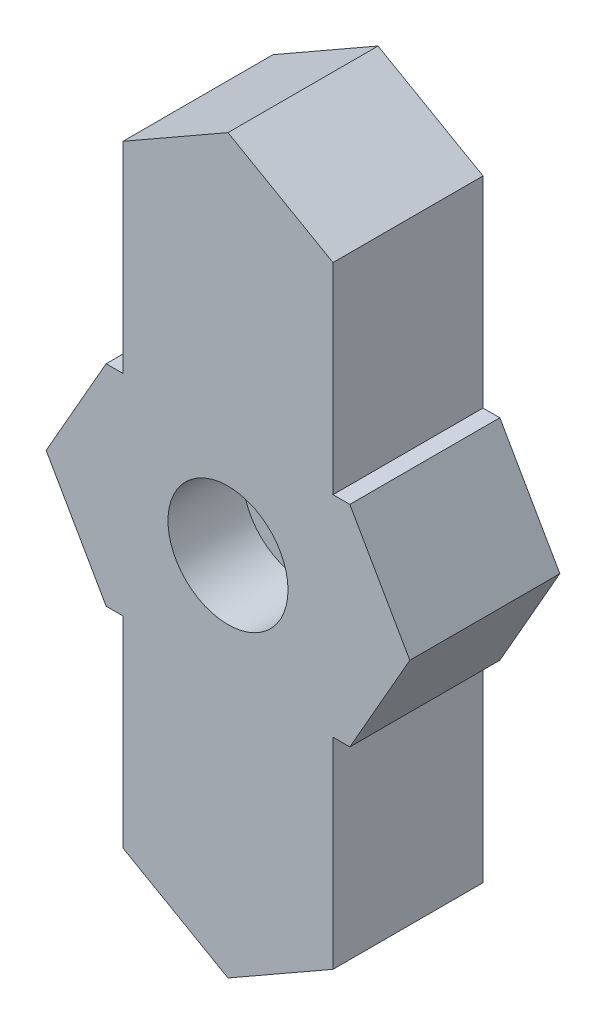
ISO-10303-21;
HEADER;
FILE_DESCRIPTION(('STEP AP214'),'2;1');
FILE_NAME('part.step','',(''),(''),'','','');
FILE_SCHEMA(('AUTOMOTIVE_DESIGN { 1 0 10303 214 1 1 1 1 }'));
ENDSEC;
DATA;
#1=APPLICATION_CONTEXT('core data for automotive mechanical design processes');
#2=APPLICATION_PROTOCOL_DEFINITION('international standard','automotive_design',2000,#1);
#3=PRODUCT_CONTEXT('',#1,'mechanical');
#4=PRODUCT('Part','Part','',(#3));
#5=PRODUCT_RELATED_PRODUCT_CATEGORY('part','',(#4));
#6=PRODUCT_DEFINITION_FORMATION('','',#4);
#7=PRODUCT_DEFINITION_CONTEXT('part definition',#1,'design');
#8=PRODUCT_DEFINITION('design','',#6,#7);
#9=PRODUCT_DEFINITION_SHAPE('','',#8);
#10=(LENGTH_UNIT() NAMED_UNIT(*) SI_UNIT(.MILLI.,.METRE.));
#11=(NAMED_UNIT(*) PLANE_ANGLE_UNIT() SI_UNIT($,.RADIAN.));
#12=(NAMED_UNIT(*) SI_UNIT($,.STERADIAN.) SOLID_ANGLE_UNIT());
#13=UNCERTAINTY_MEASURE_WITH_UNIT(LENGTH_MEASURE(1.E-05),#10,'distance_accuracy_value','');
#14=(GEOMETRIC_REPRESENTATION_CONTEXT(3) GLOBAL_UNCERTAINTY_ASSIGNED_CONTEXT((#13)) GLOBAL_UNIT_ASSIGNED_CONTEXT((#10,
#11,#12)) REPRESENTATION_CONTEXT('',''));
#15=CARTESIAN_POINT('',(0.,0.,0.));
#16=DIRECTION('',(0.,0.,1.));
#17=DIRECTION('',(1.,0.,0.));
#18=AXIS2_PLACEMENT_3D('',#15,#16,#17);
#19=CARTESIAN_POINT('',(0.,30.988,12.7));
#20=DIRECTION('',(0.496138938356834,-0.868243142124459,0.));
#21=DIRECTION('',(0.868243142124459,0.496138938356834,0.));
#22=AXIS2_PLACEMENT_3D('',#19,#20,#21);
#23=PLANE('',#22);
#24=DIRECTION('',(-0.868243142124459,-0.496138938356834,0.));
#25=VECTOR('',#24,1.);
#26=CARTESIAN_POINT('',(0.,30.988,0.));
#27=LINE('',#26,#25);
#28=CARTESIAN_POINT('',(0.,30.988,0.));
#29=VERTEX_POINT('',#28);
#30=CARTESIAN_POINT('',(-8.89,25.908,0.));
#31=VERTEX_POINT('',#30);
#32=EDGE_CURVE('E108',#29,#31,#27,.T.);
#33=ORIENTED_EDGE('',*,*,#32,.T.);
#34=DIRECTION('',(0.,0.,-1.));
#35=VECTOR('',#34,1.);
#36=CARTESIAN_POINT('',(-8.89,25.908,12.7));
#37=LINE('',#36,#35);
#38=CARTESIAN_POINT('',(-8.89,25.908,12.7));
#39=VERTEX_POINT('',#38);
#40=EDGE_CURVE('E43',#39,#31,#37,.T.);
#41=ORIENTED_EDGE('',*,*,#40,.F.);
#42=DIRECTION('',(-0.868243142124459,-0.496138938356834,0.));
#43=VECTOR('',#42,1.);
#44=CARTESIAN_POINT('',(0.,30.988,12.7));
#45=LINE('',#44,#43);
#46=CARTESIAN_POINT('',(0.,30.988,12.7));
#47=VERTEX_POINT('',#46);
#48=EDGE_CURVE('E84',#47,#39,#45,.T.);
#49=ORIENTED_EDGE('',*,*,#48,.F.);
#50=DIRECTION('',(0.,0.,-1.));
#51=VECTOR('',#50,1.);
#52=CARTESIAN_POINT('',(0.,30.988,12.7));
#53=LINE('',#52,#51);
#54=EDGE_CURVE('E11',#47,#29,#53,.T.);
#55=ORIENTED_EDGE('',*,*,#54,.T.);
#56=EDGE_LOOP('',(#33,#41,#49,#55));
#57=FACE_BOUND('',#56,.T.);
#58=ADVANCED_FACE('F35',(#57),#23,.F.);
#59=CARTESIAN_POINT('',(-8.89,25.908,12.7));
#60=DIRECTION('',(1.,0.,0.));
#61=DIRECTION('',(0.,1.,0.));
#62=AXIS2_PLACEMENT_3D('',#59,#60,#61);
#63=PLANE('',#62);
#64=DIRECTION('',(0.,-1.,0.));
#65=VECTOR('',#64,1.);
#66=CARTESIAN_POINT('',(-8.89,25.908,0.));
#67=LINE('',#66,#65);
#68=CARTESIAN_POINT('',(-8.89,8.89,0.));
#69=VERTEX_POINT('',#68);
#70=EDGE_CURVE('E69',#31,#69,#67,.T.);
#71=ORIENTED_EDGE('',*,*,#70,.T.);
#72=DIRECTION('',(0.,0.,-1.));
#73=VECTOR('',#72,1.);
#74=CARTESIAN_POINT('',(-8.89,8.89,12.7));
#75=LINE('',#74,#73);
#76=CARTESIAN_POINT('',(-8.89,8.89,12.7));
#77=VERTEX_POINT('',#76);
#78=EDGE_CURVE('E98',#77,#69,#75,.T.);
#79=ORIENTED_EDGE('',*,*,#78,.F.);
#80=DIRECTION('',(0.,-1.,0.));
#81=VECTOR('',#80,1.);
#82=CARTESIAN_POINT('',(-8.89,25.908,12.7));
#83=LINE('',#82,#81);
#84=EDGE_CURVE('E92',#39,#77,#83,.T.);
#85=ORIENTED_EDGE('',*,*,#84,.F.);
#86=ORIENTED_EDGE('',*,*,#40,.T.);
#87=EDGE_LOOP('',(#71,#79,#85,#86));
#88=FACE_BOUND('',#87,.T.);
#89=ADVANCED_FACE('F99',(#88),#63,.F.);
#90=CARTESIAN_POINT('',(-10.3124,8.89,12.7));
#91=DIRECTION('',(0.,-1.,0.));
#92=DIRECTION('',(1.,0.,0.));
#93=AXIS2_PLACEMENT_3D('',#90,#91,#92);
#94=PLANE('',#93);
#95=DIRECTION('',(-1.,0.,0.));
#96=VECTOR('',#95,1.);
#97=CARTESIAN_POINT('',(-10.3124,8.89,0.));
#98=LINE('',#97,#96);
#99=CARTESIAN_POINT('',(-10.3124,8.89,0.));
#100=VERTEX_POINT('',#99);
#101=EDGE_CURVE('E76',#69,#100,#98,.T.);
#102=ORIENTED_EDGE('',*,*,#101,.T.);
#103=DIRECTION('',(0.,0.,-1.));
#104=VECTOR('',#103,1.);
#105=CARTESIAN_POINT('',(-10.3124,8.89,12.7));
#106=LINE('',#105,#104);
#107=CARTESIAN_POINT('',(-10.3124,8.89,12.7));
#108=VERTEX_POINT('',#107);
#109=EDGE_CURVE('E100',#108,#100,#106,.T.);
#110=ORIENTED_EDGE('',*,*,#109,.F.);
#111=DIRECTION('',(-1.,0.,0.));
#112=VECTOR('',#111,1.);
#113=CARTESIAN_POINT('',(-10.3124,8.89,12.7));
#114=LINE('',#113,#112);
#115=EDGE_CURVE('E95',#77,#108,#114,.T.);
#116=ORIENTED_EDGE('',*,*,#115,.F.);
#117=ORIENTED_EDGE('',*,*,#78,.T.);
#118=EDGE_LOOP('',(#102,#110,#116,#117));
#119=FACE_BOUND('',#118,.T.);
#120=ADVANCED_FACE('F102',(#119),#94,.F.);
#121=CARTESIAN_POINT('',(-15.3924,0.,12.7));
#122=DIRECTION('',(0.868243142124459,-0.496138938356834,0.));
#123=DIRECTION('',(0.496138938356834,0.868243142124459,0.));
#124=AXIS2_PLACEMENT_3D('',#121,#122,#123);
#125=PLANE('',#124);
#126=DIRECTION('',(-0.496138938356834,-0.868243142124459,0.));
#127=VECTOR('',#126,1.);
#128=CARTESIAN_POINT('',(-15.3924,0.,0.));
#129=LINE('',#128,#127);
#130=CARTESIAN_POINT('',(-15.3924,0.,0.));
#131=VERTEX_POINT('',#130);
#132=EDGE_CURVE('E113',#100,#131,#129,.T.);
#133=ORIENTED_EDGE('',*,*,#132,.T.);
#134=DIRECTION('',(0.,0.,-1.));
#135=VECTOR('',#134,1.);
#136=CARTESIAN_POINT('',(-15.3924,0.,12.7));
#137=LINE('',#136,#135);
#138=CARTESIAN_POINT('',(-15.3924,0.,12.7));
#139=VERTEX_POINT('',#138);
#140=EDGE_CURVE('E104',#139,#131,#137,.T.);
#141=ORIENTED_EDGE('',*,*,#140,.F.);
#142=DIRECTION('',(-0.496138938356834,-0.868243142124459,0.));
#143=VECTOR('',#142,1.);
#144=CARTESIAN_POINT('',(-15.3924,0.,12.7));
#145=LINE('',#144,#143);
#146=EDGE_CURVE('E51',#108,#139,#145,.T.);
#147=ORIENTED_EDGE('',*,*,#146,.F.);
#148=ORIENTED_EDGE('',*,*,#109,.T.);
#149=EDGE_LOOP('',(#133,#141,#147,#148));
#150=FACE_BOUND('',#149,.T.);
#151=ADVANCED_FACE('F128',(#150),#125,.F.);
#152=CARTESIAN_POINT('',(0.,0.,12.7));
#153=DIRECTION('',(0.,0.,-1.));
#154=DIRECTION('',(-1.,0.,0.));
#155=AXIS2_PLACEMENT_3D('',#152,#153,#154);
#156=PLANE('',#155);
#157=CARTESIAN_POINT('',(0.,0.,12.7));
#158=DIRECTION('',(0.,0.,1.));
#159=DIRECTION('',(1.,0.,0.));
#160=AXIS2_PLACEMENT_3D('',#157,#158,#159);
#161=CIRCLE('',#160,5.08);
#162=CARTESIAN_POINT('',(5.08,0.,12.7));
#163=VERTEX_POINT('',#162);
#164=EDGE_CURVE('E231',#163,#163,#161,.T.);
#165=ORIENTED_EDGE('',*,*,#164,.F.);
#166=EDGE_LOOP('',(#165));
#167=FACE_BOUND('',#166,.T.);
#168=ORIENTED_EDGE('',*,*,#146,.T.);
#169=DIRECTION('',(-0.496138938356834,0.868243142124459,0.));
#170=VECTOR('',#169,1.);
#171=CARTESIAN_POINT('',(-15.3924,0.,12.7));
#172=LINE('',#171,#170);
#173=CARTESIAN_POINT('',(-10.3124,-8.89,12.7));
#174=VERTEX_POINT('',#173);
#175=EDGE_CURVE('E137',#174,#139,#172,.T.);
#176=ORIENTED_EDGE('',*,*,#175,.F.);
#177=DIRECTION('',(-1.,0.,0.));
#178=VECTOR('',#177,1.);
#179=CARTESIAN_POINT('',(-10.3124,-8.89,12.7));
#180=LINE('',#179,#178);
#181=CARTESIAN_POINT('',(-8.89,-8.89,12.7));
#182=VERTEX_POINT('',#181);
#183=EDGE_CURVE('E142',#182,#174,#180,.T.);
#184=ORIENTED_EDGE('',*,*,#183,.F.);
#185=DIRECTION('',(0.,1.,0.));
#186=VECTOR('',#185,1.);
#187=CARTESIAN_POINT('',(-8.89,-25.908,12.7));
#188=LINE('',#187,#186);
#189=CARTESIAN_POINT('',(-8.89,-25.908,12.7));
#190=VERTEX_POINT('',#189);
#191=EDGE_CURVE('E146',#190,#182,#188,.T.);
#192=ORIENTED_EDGE('',*,*,#191,.F.);
#193=DIRECTION('',(-0.868243142124459,0.496138938356834,0.));
#194=VECTOR('',#193,1.);
#195=CARTESIAN_POINT('',(0.,-30.988,12.7));
#196=LINE('',#195,#194);
#197=CARTESIAN_POINT('',(0.,-30.988,12.7));
#198=VERTEX_POINT('',#197);
#199=EDGE_CURVE('E159',#198,#190,#196,.T.);
#200=ORIENTED_EDGE('',*,*,#199,.F.);
#201=DIRECTION('',(0.868243142124459,0.496138938356834,0.));
#202=VECTOR('',#201,1.);
#203=CARTESIAN_POINT('',(0.,-30.988,12.7));
#204=LINE('',#203,#202);
#205=CARTESIAN_POINT('',(8.89,-25.908,12.7));
#206=VERTEX_POINT('',#205);
#207=EDGE_CURVE('E234',#198,#206,#204,.T.);
#208=ORIENTED_EDGE('',*,*,#207,.T.);
#209=DIRECTION('',(0.,1.,0.));
#210=VECTOR('',#209,1.);
#211=CARTESIAN_POINT('',(8.89,-25.908,12.7));
#212=LINE('',#211,#210);
#213=CARTESIAN_POINT('',(8.89,-8.89,12.7));
#214=VERTEX_POINT('',#213);
#215=EDGE_CURVE('E318',#206,#214,#212,.T.);
#216=ORIENTED_EDGE('',*,*,#215,.T.);
#217=DIRECTION('',(1.,0.,0.));
#218=VECTOR('',#217,1.);
#219=CARTESIAN_POINT('',(10.3124,-8.89,12.7));
#220=LINE('',#219,#218);
#221=CARTESIAN_POINT('',(10.3124,-8.89,12.7));
#222=VERTEX_POINT('',#221);
#223=EDGE_CURVE('E316',#214,#222,#220,.T.);
#224=ORIENTED_EDGE('',*,*,#223,.T.);
#225=DIRECTION('',(0.496138938356834,0.868243142124459,0.));
#226=VECTOR('',#225,1.);
#227=CARTESIAN_POINT('',(15.3924,0.,12.7));
#228=LINE('',#227,#226);
#229=CARTESIAN_POINT('',(15.3924,0.,12.7));
#230=VERTEX_POINT('',#229);
#231=EDGE_CURVE('E242',#222,#230,#228,.T.);
#232=ORIENTED_EDGE('',*,*,#231,.T.);
#233=DIRECTION('',(0.496138938356834,-0.868243142124459,0.));
#234=VECTOR('',#233,1.);
#235=CARTESIAN_POINT('',(15.3924,0.,12.7));
#236=LINE('',#235,#234);
#237=CARTESIAN_POINT('',(10.3124,8.89,12.7));
#238=VERTEX_POINT('',#237);
#239=EDGE_CURVE('E170',#238,#230,#236,.T.);
#240=ORIENTED_EDGE('',*,*,#239,.F.);
#241=DIRECTION('',(1.,0.,0.));
#242=VECTOR('',#241,1.);
#243=CARTESIAN_POINT('',(10.3124,8.89,12.7));
#244=LINE('',#243,#242);
#245=CARTESIAN_POINT('',(8.89,8.89,12.7));
#246=VERTEX_POINT('',#245);
#247=EDGE_CURVE('E173',#246,#238,#244,.T.);
#248=ORIENTED_EDGE('',*,*,#247,.F.);
#249=DIRECTION('',(0.,-1.,0.));
#250=VECTOR('',#249,1.);
#251=CARTESIAN_POINT('',(8.89,25.908,12.7));
#252=LINE('',#251,#250);
#253=CARTESIAN_POINT('',(8.89,25.908,12.7));
#254=VERTEX_POINT('',#253);
#255=EDGE_CURVE('E177',#254,#246,#252,.T.);
#256=ORIENTED_EDGE('',*,*,#255,.F.);
#257=DIRECTION('',(0.868243142124459,-0.496138938356834,0.));
#258=VECTOR('',#257,1.);
#259=CARTESIAN_POINT('',(0.,30.988,12.7));
#260=LINE('',#259,#258);
#261=EDGE_CURVE('E180',#47,#254,#260,.T.);
#262=ORIENTED_EDGE('',*,*,#261,.F.);
#263=ORIENTED_EDGE('',*,*,#48,.T.);
#264=ORIENTED_EDGE('',*,*,#84,.T.);
#265=ORIENTED_EDGE('',*,*,#115,.T.);
#266=EDGE_LOOP('',(#168,#176,#184,#192,#200,#208,#216,#224,#232,#240,#248,#256,#262,#263,#264,#265));
#267=FACE_BOUND('',#266,.T.);
#268=ADVANCED_FACE('F93',(#167,#267),#156,.F.);
#269=CARTESIAN_POINT('',(0.,0.,0.));
#270=DIRECTION('',(0.,0.,-1.));
#271=DIRECTION('',(-1.,0.,0.));
#272=AXIS2_PLACEMENT_3D('',#269,#270,#271);
#273=PLANE('',#272);
#274=ORIENTED_EDGE('',*,*,#32,.F.);
#275=DIRECTION('',(0.868243142124459,-0.496138938356834,0.));
#276=VECTOR('',#275,1.);
#277=CARTESIAN_POINT('',(0.,30.988,0.));
#278=LINE('',#277,#276);
#279=CARTESIAN_POINT('',(8.89,25.908,0.));
#280=VERTEX_POINT('',#279);
#281=EDGE_CURVE('E174',#29,#280,#278,.T.);
#282=ORIENTED_EDGE('',*,*,#281,.T.);
#283=DIRECTION('',(0.,-1.,0.));
#284=VECTOR('',#283,1.);
#285=CARTESIAN_POINT('',(8.89,25.908,0.));
#286=LINE('',#285,#284);
#287=CARTESIAN_POINT('',(8.89,8.89,0.));
#288=VERTEX_POINT('',#287);
#289=EDGE_CURVE('E189',#280,#288,#286,.T.);
#290=ORIENTED_EDGE('',*,*,#289,.T.);
#291=DIRECTION('',(1.,0.,0.));
#292=VECTOR('',#291,1.);
#293=CARTESIAN_POINT('',(10.3124,8.89,0.));
#294=LINE('',#293,#292);
#295=CARTESIAN_POINT('',(10.3124,8.89,0.));
#296=VERTEX_POINT('',#295);
#297=EDGE_CURVE('E186',#288,#296,#294,.T.);
#298=ORIENTED_EDGE('',*,*,#297,.T.);
#299=DIRECTION('',(0.496138938356834,-0.868243142124459,0.));
#300=VECTOR('',#299,1.);
#301=CARTESIAN_POINT('',(15.3924,0.,0.));
#302=LINE('',#301,#300);
#303=CARTESIAN_POINT('',(15.3924,0.,0.));
#304=VERTEX_POINT('',#303);
#305=EDGE_CURVE('E169',#296,#304,#302,.T.);
#306=ORIENTED_EDGE('',*,*,#305,.T.);
#307=DIRECTION('',(0.496138938356834,0.868243142124459,0.));
#308=VECTOR('',#307,1.);
#309=CARTESIAN_POINT('',(15.3924,0.,0.));
#310=LINE('',#309,#308);
#311=CARTESIAN_POINT('',(10.3124,-8.89,0.));
#312=VERTEX_POINT('',#311);
#313=EDGE_CURVE('E219',#312,#304,#310,.T.);
#314=ORIENTED_EDGE('',*,*,#313,.F.);
#315=DIRECTION('',(1.,0.,0.));
#316=VECTOR('',#315,1.);
#317=CARTESIAN_POINT('',(10.3124,-8.89,0.));
#318=LINE('',#317,#316);
#319=CARTESIAN_POINT('',(8.89,-8.89,0.));
#320=VERTEX_POINT('',#319);
#321=EDGE_CURVE('E225',#320,#312,#318,.T.);
#322=ORIENTED_EDGE('',*,*,#321,.F.);
#323=DIRECTION('',(0.,1.,0.));
#324=VECTOR('',#323,1.);
#325=CARTESIAN_POINT('',(8.89,-25.908,0.));
#326=LINE('',#325,#324);
#327=CARTESIAN_POINT('',(8.89,-25.908,0.));
#328=VERTEX_POINT('',#327);
#329=EDGE_CURVE('E228',#328,#320,#326,.T.);
#330=ORIENTED_EDGE('',*,*,#329,.F.);
#331=DIRECTION('',(0.868243142124459,0.496138938356834,0.));
#332=VECTOR('',#331,1.);
#333=CARTESIAN_POINT('',(0.,-30.988,0.));
#334=LINE('',#333,#332);
#335=CARTESIAN_POINT('',(0.,-30.988,0.));
#336=VERTEX_POINT('',#335);
#337=EDGE_CURVE('E239',#336,#328,#334,.T.);
#338=ORIENTED_EDGE('',*,*,#337,.F.);
#339=DIRECTION('',(-0.868243142124459,0.496138938356834,0.));
#340=VECTOR('',#339,1.);
#341=CARTESIAN_POINT('',(0.,-30.988,0.));
#342=LINE('',#341,#340);
#343=CARTESIAN_POINT('',(-8.89,-25.908,0.));
#344=VERTEX_POINT('',#343);
#345=EDGE_CURVE('E150',#336,#344,#342,.T.);
#346=ORIENTED_EDGE('',*,*,#345,.T.);
#347=DIRECTION('',(0.,1.,0.));
#348=VECTOR('',#347,1.);
#349=CARTESIAN_POINT('',(-8.89,-25.908,0.));
#350=LINE('',#349,#348);
#351=CARTESIAN_POINT('',(-8.89,-8.89,0.));
#352=VERTEX_POINT('',#351);
#353=EDGE_CURVE('E153',#344,#352,#350,.T.);
#354=ORIENTED_EDGE('',*,*,#353,.T.);
#355=DIRECTION('',(-1.,0.,0.));
#356=VECTOR('',#355,1.);
#357=CARTESIAN_POINT('',(-10.3124,-8.89,0.));
#358=LINE('',#357,#356);
#359=CARTESIAN_POINT('',(-10.3124,-8.89,0.));
#360=VERTEX_POINT('',#359);
#361=EDGE_CURVE('E157',#352,#360,#358,.T.);
#362=ORIENTED_EDGE('',*,*,#361,.T.);
#363=DIRECTION('',(-0.496138938356834,0.868243142124459,0.));
#364=VECTOR('',#363,1.);
#365=CARTESIAN_POINT('',(-15.3924,0.,0.));
#366=LINE('',#365,#364);
#367=EDGE_CURVE('E126',#360,#131,#366,.T.);
#368=ORIENTED_EDGE('',*,*,#367,.T.);
#369=ORIENTED_EDGE('',*,*,#132,.F.);
#370=ORIENTED_EDGE('',*,*,#101,.F.);
#371=ORIENTED_EDGE('',*,*,#70,.F.);
#372=EDGE_LOOP('',(#274,#282,#290,#298,#306,#314,#322,#330,#338,#346,#354,#362,#368,#369,#370,#371));
#373=FACE_BOUND('',#372,.T.);
#374=ADVANCED_FACE('F119',(#373),#273,.T.);
#375=CARTESIAN_POINT('',(15.3924,0.,12.7));
#376=DIRECTION('',(0.868243142124459,0.496138938356834,0.));
#377=DIRECTION('',(-0.496138938356834,0.868243142124459,0.));
#378=AXIS2_PLACEMENT_3D('',#375,#376,#377);
#379=PLANE('',#378);
#380=ORIENTED_EDGE('',*,*,#305,.F.);
#381=DIRECTION('',(0.,0.,-1.));
#382=VECTOR('',#381,1.);
#383=CARTESIAN_POINT('',(10.3124,8.89,12.7));
#384=LINE('',#383,#382);
#385=EDGE_CURVE('E198',#238,#296,#384,.T.);
#386=ORIENTED_EDGE('',*,*,#385,.F.);
#387=ORIENTED_EDGE('',*,*,#239,.T.);
#388=DIRECTION('',(0.,0.,-1.));
#389=VECTOR('',#388,1.);
#390=CARTESIAN_POINT('',(15.3924,0.,12.7));
#391=LINE('',#390,#389);
#392=EDGE_CURVE('E110',#230,#304,#391,.T.);
#393=ORIENTED_EDGE('',*,*,#392,.T.);
#394=EDGE_LOOP('',(#380,#386,#387,#393));
#395=FACE_BOUND('',#394,.T.);
#396=ADVANCED_FACE('F206',(#395),#379,.T.);
#397=CARTESIAN_POINT('',(10.3124,8.89,12.7));
#398=DIRECTION('',(0.,1.,0.));
#399=DIRECTION('',(-1.,0.,0.));
#400=AXIS2_PLACEMENT_3D('',#397,#398,#399);
#401=PLANE('',#400);
#402=ORIENTED_EDGE('',*,*,#297,.F.);
#403=DIRECTION('',(0.,0.,-1.));
#404=VECTOR('',#403,1.);
#405=CARTESIAN_POINT('',(8.89,8.89,12.7));
#406=LINE('',#405,#404);
#407=EDGE_CURVE('E195',#246,#288,#406,.T.);
#408=ORIENTED_EDGE('',*,*,#407,.F.);
#409=ORIENTED_EDGE('',*,*,#247,.T.);
#410=ORIENTED_EDGE('',*,*,#385,.T.);
#411=EDGE_LOOP('',(#402,#408,#409,#410));
#412=FACE_BOUND('',#411,.T.);
#413=ADVANCED_FACE('F297',(#412),#401,.T.);
#414=CARTESIAN_POINT('',(8.89,25.908,12.7));
#415=DIRECTION('',(1.,0.,0.));
#416=DIRECTION('',(0.,1.,0.));
#417=AXIS2_PLACEMENT_3D('',#414,#415,#416);
#418=PLANE('',#417);
#419=ORIENTED_EDGE('',*,*,#289,.F.);
#420=DIRECTION('',(0.,0.,-1.));
#421=VECTOR('',#420,1.);
#422=CARTESIAN_POINT('',(8.89,25.908,12.7));
#423=LINE('',#422,#421);
#424=EDGE_CURVE('E183',#254,#280,#423,.T.);
#425=ORIENTED_EDGE('',*,*,#424,.F.);
#426=ORIENTED_EDGE('',*,*,#255,.T.);
#427=ORIENTED_EDGE('',*,*,#407,.T.);
#428=EDGE_LOOP('',(#419,#425,#426,#427));
#429=FACE_BOUND('',#428,.T.);
#430=ADVANCED_FACE('F295',(#429),#418,.T.);
#431=CARTESIAN_POINT('',(0.,30.988,12.7));
#432=DIRECTION('',(0.496138938356834,0.868243142124459,0.));
#433=DIRECTION('',(-0.868243142124459,0.496138938356834,0.));
#434=AXIS2_PLACEMENT_3D('',#431,#432,#433);
#435=PLANE('',#434);
#436=ORIENTED_EDGE('',*,*,#281,.F.);
#437=ORIENTED_EDGE('',*,*,#54,.F.);
#438=ORIENTED_EDGE('',*,*,#261,.T.);
#439=ORIENTED_EDGE('',*,*,#424,.T.);
#440=EDGE_LOOP('',(#436,#437,#438,#439));
#441=FACE_BOUND('',#440,.T.);
#442=ADVANCED_FACE('F293',(#441),#435,.T.);
#443=CARTESIAN_POINT('',(0.,-30.988,12.7));
#444=DIRECTION('',(0.496138938356834,0.868243142124459,0.));
#445=DIRECTION('',(0.868243142124459,-0.496138938356834,0.));
#446=AXIS2_PLACEMENT_3D('',#443,#444,#445);
#447=PLANE('',#446);
#448=ORIENTED_EDGE('',*,*,#345,.F.);
#449=DIRECTION('',(0.,0.,-1.));
#450=VECTOR('',#449,1.);
#451=CARTESIAN_POINT('',(0.,-30.988,12.7));
#452=LINE('',#451,#450);
#453=EDGE_CURVE('E166',#198,#336,#452,.T.);
#454=ORIENTED_EDGE('',*,*,#453,.F.);
#455=ORIENTED_EDGE('',*,*,#199,.T.);
#456=DIRECTION('',(0.,0.,-1.));
#457=VECTOR('',#456,1.);
#458=CARTESIAN_POINT('',(-8.89,-25.908,12.7));
#459=LINE('',#458,#457);
#460=EDGE_CURVE('E163',#190,#344,#459,.T.);
#461=ORIENTED_EDGE('',*,*,#460,.T.);
#462=EDGE_LOOP('',(#448,#454,#455,#461));
#463=FACE_BOUND('',#462,.T.);
#464=ADVANCED_FACE('F303',(#463),#447,.F.);
#465=CARTESIAN_POINT('',(-8.89,-25.908,12.7));
#466=DIRECTION('',(1.,0.,0.));
#467=DIRECTION('',(0.,-1.,0.));
#468=AXIS2_PLACEMENT_3D('',#465,#466,#467);
#469=PLANE('',#468);
#470=ORIENTED_EDGE('',*,*,#353,.F.);
#471=ORIENTED_EDGE('',*,*,#460,.F.);
#472=ORIENTED_EDGE('',*,*,#191,.T.);
#473=DIRECTION('',(0.,0.,-1.));
#474=VECTOR('',#473,1.);
#475=CARTESIAN_POINT('',(-8.89,-8.89,12.7));
#476=LINE('',#475,#474);
#477=EDGE_CURVE('E144',#182,#352,#476,.T.);
#478=ORIENTED_EDGE('',*,*,#477,.T.);
#479=EDGE_LOOP('',(#470,#471,#472,#478));
#480=FACE_BOUND('',#479,.T.);
#481=ADVANCED_FACE('F257',(#480),#469,.F.);
#482=CARTESIAN_POINT('',(-10.3124,-8.89,12.7));
#483=DIRECTION('',(0.,1.,0.));
#484=DIRECTION('',(1.,0.,0.));
#485=AXIS2_PLACEMENT_3D('',#482,#483,#484);
#486=PLANE('',#485);
#487=ORIENTED_EDGE('',*,*,#361,.F.);
#488=ORIENTED_EDGE('',*,*,#477,.F.);
#489=ORIENTED_EDGE('',*,*,#183,.T.);
#490=DIRECTION('',(0.,0.,-1.));
#491=VECTOR('',#490,1.);
#492=CARTESIAN_POINT('',(-10.3124,-8.89,12.7));
#493=LINE('',#492,#491);
#494=EDGE_CURVE('E139',#174,#360,#493,.T.);
#495=ORIENTED_EDGE('',*,*,#494,.T.);
#496=EDGE_LOOP('',(#487,#488,#489,#495));
#497=FACE_BOUND('',#496,.T.);
#498=ADVANCED_FACE('F346',(#497),#486,.F.);
#499=CARTESIAN_POINT('',(-15.3924,0.,12.7));
#500=DIRECTION('',(0.868243142124459,0.496138938356834,0.));
#501=DIRECTION('',(0.496138938356834,-0.868243142124459,0.));
#502=AXIS2_PLACEMENT_3D('',#499,#500,#501);
#503=PLANE('',#502);
#504=ORIENTED_EDGE('',*,*,#367,.F.);
#505=ORIENTED_EDGE('',*,*,#494,.F.);
#506=ORIENTED_EDGE('',*,*,#175,.T.);
#507=ORIENTED_EDGE('',*,*,#140,.T.);
#508=EDGE_LOOP('',(#504,#505,#506,#507));
#509=FACE_BOUND('',#508,.T.);
#510=ADVANCED_FACE('F134',(#509),#503,.F.);
#511=CARTESIAN_POINT('',(15.3924,0.,12.7));
#512=DIRECTION('',(0.868243142124459,-0.496138938356834,0.));
#513=DIRECTION('',(-0.496138938356834,-0.868243142124459,0.));
#514=AXIS2_PLACEMENT_3D('',#511,#512,#513);
#515=PLANE('',#514);
#516=ORIENTED_EDGE('',*,*,#313,.T.);
#517=ORIENTED_EDGE('',*,*,#392,.F.);
#518=ORIENTED_EDGE('',*,*,#231,.F.);
#519=DIRECTION('',(0.,0.,-1.));
#520=VECTOR('',#519,1.);
#521=CARTESIAN_POINT('',(10.3124,-8.89,12.7));
#522=LINE('',#521,#520);
#523=EDGE_CURVE('E154',#222,#312,#522,.T.);
#524=ORIENTED_EDGE('',*,*,#523,.T.);
#525=EDGE_LOOP('',(#516,#517,#518,#524));
#526=FACE_BOUND('',#525,.T.);
#527=ADVANCED_FACE('F222',(#526),#515,.T.);
#528=CARTESIAN_POINT('',(10.3124,-8.89,12.7));
#529=DIRECTION('',(0.,-1.,0.));
#530=DIRECTION('',(-1.,0.,0.));
#531=AXIS2_PLACEMENT_3D('',#528,#529,#530);
#532=PLANE('',#531);
#533=ORIENTED_EDGE('',*,*,#321,.T.);
#534=ORIENTED_EDGE('',*,*,#523,.F.);
#535=ORIENTED_EDGE('',*,*,#223,.F.);
#536=DIRECTION('',(0.,0.,-1.));
#537=VECTOR('',#536,1.);
#538=CARTESIAN_POINT('',(8.89,-8.89,12.7));
#539=LINE('',#538,#537);
#540=EDGE_CURVE('E246',#214,#320,#539,.T.);
#541=ORIENTED_EDGE('',*,*,#540,.T.);
#542=EDGE_LOOP('',(#533,#534,#535,#541));
#543=FACE_BOUND('',#542,.T.);
#544=ADVANCED_FACE('F336',(#543),#532,.T.);
#545=CARTESIAN_POINT('',(8.89,-25.908,12.7));
#546=DIRECTION('',(1.,0.,0.));
#547=DIRECTION('',(0.,-1.,0.));
#548=AXIS2_PLACEMENT_3D('',#545,#546,#547);
#549=PLANE('',#548);
#550=ORIENTED_EDGE('',*,*,#329,.T.);
#551=ORIENTED_EDGE('',*,*,#540,.F.);
#552=ORIENTED_EDGE('',*,*,#215,.F.);
#553=DIRECTION('',(0.,0.,-1.));
#554=VECTOR('',#553,1.);
#555=CARTESIAN_POINT('',(8.89,-25.908,12.7));
#556=LINE('',#555,#554);
#557=EDGE_CURVE('E243',#206,#328,#556,.T.);
#558=ORIENTED_EDGE('',*,*,#557,.T.);
#559=EDGE_LOOP('',(#550,#551,#552,#558));
#560=FACE_BOUND('',#559,.T.);
#561=ADVANCED_FACE('F332',(#560),#549,.T.);
#562=CARTESIAN_POINT('',(0.,-30.988,12.7));
#563=DIRECTION('',(0.496138938356834,-0.868243142124459,0.));
#564=DIRECTION('',(-0.868243142124459,-0.496138938356834,0.));
#565=AXIS2_PLACEMENT_3D('',#562,#563,#564);
#566=PLANE('',#565);
#567=ORIENTED_EDGE('',*,*,#337,.T.);
#568=ORIENTED_EDGE('',*,*,#557,.F.);
#569=ORIENTED_EDGE('',*,*,#207,.F.);
#570=ORIENTED_EDGE('',*,*,#453,.T.);
#571=EDGE_LOOP('',(#567,#568,#569,#570));
#572=FACE_BOUND('',#571,.T.);
#573=ADVANCED_FACE('F326',(#572),#566,.T.);
#574=CARTESIAN_POINT('',(0.,0.,6.35));
#575=DIRECTION('',(0.,0.,1.));
#576=DIRECTION('',(1.,0.,0.));
#577=AXIS2_PLACEMENT_3D('',#574,#575,#576);
#578=CYLINDRICAL_SURFACE('',#577,5.08);
#579=CARTESIAN_POINT('',(0.,0.,6.35));
#580=DIRECTION('',(0.,0.,1.));
#581=DIRECTION('',(1.,0.,0.));
#582=AXIS2_PLACEMENT_3D('',#579,#580,#581);
#583=CIRCLE('',#582,5.08);
#584=CARTESIAN_POINT('',(5.08,0.,6.35));
#585=VERTEX_POINT('',#584);
#586=EDGE_CURVE('E226',#585,#585,#583,.T.);
#587=ORIENTED_EDGE('',*,*,#586,.F.);
#588=EDGE_LOOP('',(#587));
#589=FACE_BOUND('',#588,.T.);
#590=ORIENTED_EDGE('',*,*,#164,.T.);
#591=EDGE_LOOP('',(#590));
#592=FACE_BOUND('',#591,.T.);
#593=ADVANCED_FACE('F362',(#589,#592),#578,.F.);
#594=CARTESIAN_POINT('',(0.,0.,6.35));
#595=DIRECTION('',(0.,0.,1.));
#596=DIRECTION('',(1.,0.,0.));
#597=AXIS2_PLACEMENT_3D('',#594,#595,#596);
#598=PLANE('',#597);
#599=ORIENTED_EDGE('',*,*,#586,.T.);
#600=EDGE_LOOP('',(#599));
#601=FACE_BOUND('',#600,.T.);
#602=ADVANCED_FACE('F365',(#601),#598,.T.);
#603=CLOSED_SHELL('',(#58,#89,#120,#151,#268,#374,#396,#413,#430,#442,#464,#481,#498,#510,#527,
#544,#561,#573,#593,#602));
#604=MANIFOLD_SOLID_BREP('B2',#603);
#605=ADVANCED_BREP_SHAPE_REPRESENTATION('',(#18,#604),#14);
#606=SHAPE_DEFINITION_REPRESENTATION(#9,#605);
ENDSEC;
END-ISO-10303-21;
